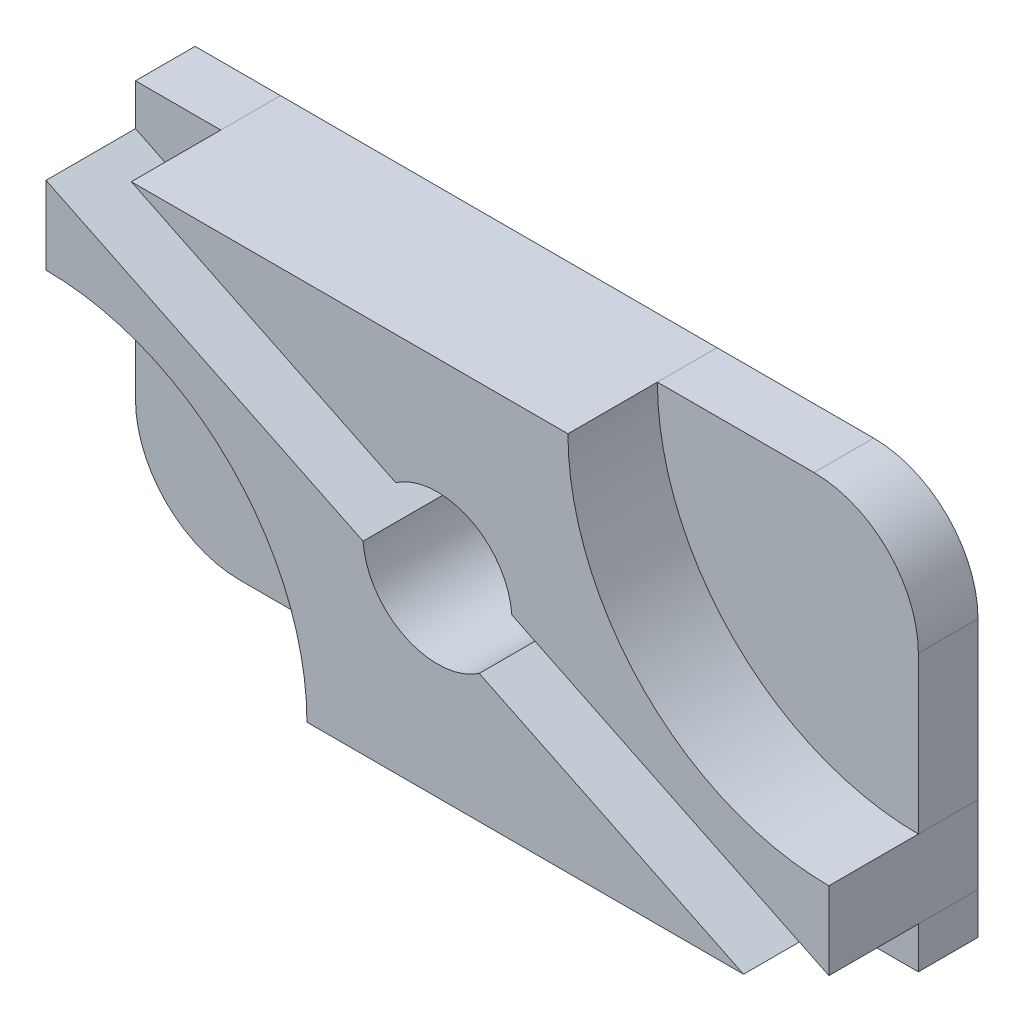
ISO-10303-21;
HEADER;
FILE_DESCRIPTION(('STEP AP214'),'2;1');
FILE_NAME('part.step','',(''),(''),'','','');
FILE_SCHEMA(('AUTOMOTIVE_DESIGN { 1 0 10303 214 1 1 1 1 }'));
ENDSEC;
DATA;
#1=APPLICATION_CONTEXT('core data for automotive mechanical design processes');
#2=APPLICATION_PROTOCOL_DEFINITION('international standard','automotive_design',2000,#1);
#3=PRODUCT_CONTEXT('',#1,'mechanical');
#4=PRODUCT('Part','Part','',(#3));
#5=PRODUCT_RELATED_PRODUCT_CATEGORY('part','',(#4));
#6=PRODUCT_DEFINITION_FORMATION('','',#4);
#7=PRODUCT_DEFINITION_CONTEXT('part definition',#1,'design');
#8=PRODUCT_DEFINITION('design','',#6,#7);
#9=PRODUCT_DEFINITION_SHAPE('','',#8);
#10=(LENGTH_UNIT() NAMED_UNIT(*) SI_UNIT(.MILLI.,.METRE.));
#11=(NAMED_UNIT(*) PLANE_ANGLE_UNIT() SI_UNIT($,.RADIAN.));
#12=(NAMED_UNIT(*) SI_UNIT($,.STERADIAN.) SOLID_ANGLE_UNIT());
#13=UNCERTAINTY_MEASURE_WITH_UNIT(LENGTH_MEASURE(1.E-05),#10,'distance_accuracy_value','');
#14=(GEOMETRIC_REPRESENTATION_CONTEXT(3) GLOBAL_UNCERTAINTY_ASSIGNED_CONTEXT((#13)) GLOBAL_UNIT_ASSIGNED_CONTEXT((#10,
#11,#12)) REPRESENTATION_CONTEXT('',''));
#15=CARTESIAN_POINT('',(0.,0.,0.));
#16=DIRECTION('',(0.,0.,1.));
#17=DIRECTION('',(1.,0.,0.));
#18=AXIS2_PLACEMENT_3D('',#15,#16,#17);
#19=CARTESIAN_POINT('',(38.5,11.5,8.));
#20=DIRECTION('',(0.,0.,-1.));
#21=DIRECTION('',(-1.,0.,0.));
#22=AXIS2_PLACEMENT_3D('',#19,#20,#21);
#23=CYLINDRICAL_SURFACE('',#22,14.);
#24=CARTESIAN_POINT('',(38.5,11.5,0.));
#25=DIRECTION('',(0.,0.,1.));
#26=DIRECTION('',(1.,0.,0.));
#27=AXIS2_PLACEMENT_3D('',#24,#25,#26);
#28=CIRCLE('',#27,14.);
#29=CARTESIAN_POINT('',(38.4999999999999,25.5,0.));
#30=VERTEX_POINT('',#29);
#31=CARTESIAN_POINT('',(52.5,11.4999999999999,0.));
#32=VERTEX_POINT('',#31);
#33=EDGE_CURVE('E201',#30,#32,#28,.F.);
#34=ORIENTED_EDGE('',*,*,#33,.F.);
#35=DIRECTION('',(0.,0.,-1.));
#36=VECTOR('',#35,1.);
#37=CARTESIAN_POINT('',(38.4999999999999,25.5,8.));
#38=LINE('',#37,#36);
#39=CARTESIAN_POINT('',(38.4999999999999,25.5,8.));
#40=VERTEX_POINT('',#39);
#41=EDGE_CURVE('E13',#40,#30,#38,.T.);
#42=ORIENTED_EDGE('',*,*,#41,.F.);
#43=CARTESIAN_POINT('',(38.5,11.5,8.));
#44=DIRECTION('',(0.,0.,1.));
#45=DIRECTION('',(1.,0.,0.));
#46=AXIS2_PLACEMENT_3D('',#43,#44,#45);
#47=CIRCLE('',#46,14.);
#48=CARTESIAN_POINT('',(52.5,11.4999999999999,8.));
#49=VERTEX_POINT('',#48);
#50=EDGE_CURVE('E197',#40,#49,#47,.F.);
#51=ORIENTED_EDGE('',*,*,#50,.T.);
#52=DIRECTION('',(0.,0.,-1.));
#53=VECTOR('',#52,1.);
#54=CARTESIAN_POINT('',(52.5,11.4999999999999,8.));
#55=LINE('',#54,#53);
#56=EDGE_CURVE('E176',#49,#32,#55,.T.);
#57=ORIENTED_EDGE('',*,*,#56,.T.);
#58=EDGE_LOOP('',(#34,#42,#51,#57));
#59=FACE_BOUND('',#58,.T.);
#60=ADVANCED_FACE('F139',(#59),#23,.T.);
#61=CARTESIAN_POINT('',(0.,25.5,8.));
#62=DIRECTION('',(0.,1.,0.));
#63=DIRECTION('',(0.,0.,1.));
#64=AXIS2_PLACEMENT_3D('',#61,#62,#63);
#65=PLANE('',#64);
#66=DIRECTION('',(1.,0.,0.));
#67=VECTOR('',#66,1.);
#68=CARTESIAN_POINT('',(0.,25.5,0.));
#69=LINE('',#68,#67);
#70=CARTESIAN_POINT('',(17.5,25.5,0.));
#71=VERTEX_POINT('',#70);
#72=EDGE_CURVE('E193',#71,#30,#69,.T.);
#73=ORIENTED_EDGE('',*,*,#72,.F.);
#74=DIRECTION('',(0.,0.,-1.));
#75=VECTOR('',#74,1.);
#76=CARTESIAN_POINT('',(17.5,25.5,8.));
#77=LINE('',#76,#75);
#78=CARTESIAN_POINT('',(17.5,25.5,8.));
#79=VERTEX_POINT('',#78);
#80=EDGE_CURVE('E146',#79,#71,#77,.T.);
#81=ORIENTED_EDGE('',*,*,#80,.F.);
#82=DIRECTION('',(1.,0.,0.));
#83=VECTOR('',#82,1.);
#84=CARTESIAN_POINT('',(0.,25.5,8.));
#85=LINE('',#84,#83);
#86=EDGE_CURVE('E186',#79,#40,#85,.T.);
#87=ORIENTED_EDGE('',*,*,#86,.T.);
#88=ORIENTED_EDGE('',*,*,#41,.T.);
#89=EDGE_LOOP('',(#73,#81,#87,#88));
#90=FACE_BOUND('',#89,.T.);
#91=ADVANCED_FACE('F190',(#90),#65,.T.);
#92=CARTESIAN_POINT('',(52.5,25.5,8.));
#93=DIRECTION('',(0.,0.,-1.));
#94=DIRECTION('',(-1.,0.,0.));
#95=AXIS2_PLACEMENT_3D('',#92,#93,#94);
#96=CYLINDRICAL_SURFACE('',#95,35.);
#97=CARTESIAN_POINT('',(52.5,25.5,0.));
#98=DIRECTION('',(0.,0.,1.));
#99=DIRECTION('',(1.,0.,0.));
#100=AXIS2_PLACEMENT_3D('',#97,#98,#99);
#101=CIRCLE('',#100,35.);
#102=CARTESIAN_POINT('',(52.5,-9.50000000000001,0.));
#103=VERTEX_POINT('',#102);
#104=EDGE_CURVE('E172',#71,#103,#101,.T.);
#105=ORIENTED_EDGE('',*,*,#104,.T.);
#106=DIRECTION('',(0.,0.,-1.));
#107=VECTOR('',#106,1.);
#108=CARTESIAN_POINT('',(52.5,-9.50000000000001,8.));
#109=LINE('',#108,#107);
#110=CARTESIAN_POINT('',(52.5,-9.50000000000001,8.));
#111=VERTEX_POINT('',#110);
#112=EDGE_CURVE('E195',#111,#103,#109,.T.);
#113=ORIENTED_EDGE('',*,*,#112,.F.);
#114=CARTESIAN_POINT('',(52.5,25.5,8.));
#115=DIRECTION('',(0.,0.,1.));
#116=DIRECTION('',(1.,0.,0.));
#117=AXIS2_PLACEMENT_3D('',#114,#115,#116);
#118=CIRCLE('',#117,35.);
#119=EDGE_CURVE('E191',#79,#111,#118,.T.);
#120=ORIENTED_EDGE('',*,*,#119,.F.);
#121=ORIENTED_EDGE('',*,*,#80,.T.);
#122=EDGE_LOOP('',(#105,#113,#120,#121));
#123=FACE_BOUND('',#122,.T.);
#124=ADVANCED_FACE('F192',(#123),#96,.T.);
#125=CARTESIAN_POINT('',(52.5,0.,8.));
#126=DIRECTION('',(-1.,0.,0.));
#127=DIRECTION('',(0.,0.,1.));
#128=AXIS2_PLACEMENT_3D('',#125,#126,#127);
#129=PLANE('',#128);
#130=DIRECTION('',(0.,1.,0.));
#131=VECTOR('',#130,1.);
#132=CARTESIAN_POINT('',(52.5,0.,0.));
#133=LINE('',#132,#131);
#134=EDGE_CURVE('E200',#103,#32,#133,.T.);
#135=ORIENTED_EDGE('',*,*,#134,.T.);
#136=ORIENTED_EDGE('',*,*,#56,.F.);
#137=DIRECTION('',(0.,1.,0.));
#138=VECTOR('',#137,1.);
#139=CARTESIAN_POINT('',(52.5,0.,8.));
#140=LINE('',#139,#138);
#141=EDGE_CURVE('E156',#111,#49,#140,.T.);
#142=ORIENTED_EDGE('',*,*,#141,.F.);
#143=ORIENTED_EDGE('',*,*,#112,.T.);
#144=EDGE_LOOP('',(#135,#136,#142,#143));
#145=FACE_BOUND('',#144,.T.);
#146=ADVANCED_FACE('F215',(#145),#129,.F.);
#147=CARTESIAN_POINT('',(0.,0.,8.));
#148=DIRECTION('',(0.,0.,1.));
#149=DIRECTION('',(1.,0.,0.));
#150=AXIS2_PLACEMENT_3D('',#147,#148,#149);
#151=PLANE('',#150);
#152=ORIENTED_EDGE('',*,*,#50,.F.);
#153=ORIENTED_EDGE('',*,*,#86,.F.);
#154=ORIENTED_EDGE('',*,*,#119,.T.);
#155=ORIENTED_EDGE('',*,*,#141,.T.);
#156=EDGE_LOOP('',(#152,#153,#154,#155));
#157=FACE_BOUND('',#156,.T.);
#158=ADVANCED_FACE('F198',(#157),#151,.T.);
#159=CARTESIAN_POINT('',(0.,0.,0.));
#160=DIRECTION('',(0.,0.,1.));
#161=DIRECTION('',(1.,0.,0.));
#162=AXIS2_PLACEMENT_3D('',#159,#160,#161);
#163=PLANE('',#162);
#164=ORIENTED_EDGE('',*,*,#33,.T.);
#165=ORIENTED_EDGE('',*,*,#134,.F.);
#166=ORIENTED_EDGE('',*,*,#104,.F.);
#167=ORIENTED_EDGE('',*,*,#72,.T.);
#168=EDGE_LOOP('',(#164,#165,#166,#167));
#169=FACE_BOUND('',#168,.T.);
#170=ADVANCED_FACE('F212',(#169),#163,.F.);
#171=CLOSED_SHELL('',(#60,#91,#124,#146,#158,#170));
#172=MANIFOLD_SOLID_BREP('B2',#171);
#173=CARTESIAN_POINT('',(52.5,25.5,20.));
#174=DIRECTION('',(0.,0.,-1.));
#175=DIRECTION('',(-1.,0.,0.));
#176=AXIS2_PLACEMENT_3D('',#173,#174,#175);
#177=CYLINDRICAL_SURFACE('',#176,35.);
#178=CARTESIAN_POINT('',(52.5,25.5,0.));
#179=DIRECTION('',(0.,0.,1.));
#180=DIRECTION('',(1.,0.,0.));
#181=AXIS2_PLACEMENT_3D('',#178,#179,#180);
#182=CIRCLE('',#181,35.);
#183=CARTESIAN_POINT('',(17.5,25.5,0.));
#184=VERTEX_POINT('',#183);
#185=CARTESIAN_POINT('',(52.5,-9.50000000000001,0.));
#186=VERTEX_POINT('',#185);
#187=EDGE_CURVE('E353',#184,#186,#182,.T.);
#188=ORIENTED_EDGE('',*,*,#187,.F.);
#189=DIRECTION('',(0.,0.,-1.));
#190=VECTOR('',#189,1.);
#191=CARTESIAN_POINT('',(17.5,25.5,20.));
#192=LINE('',#191,#190);
#193=CARTESIAN_POINT('',(17.5,25.5,20.));
#194=VERTEX_POINT('',#193);
#195=EDGE_CURVE('E136',#194,#184,#192,.T.);
#196=ORIENTED_EDGE('',*,*,#195,.F.);
#197=CARTESIAN_POINT('',(52.5,25.5,20.));
#198=DIRECTION('',(0.,0.,1.));
#199=DIRECTION('',(1.,0.,0.));
#200=AXIS2_PLACEMENT_3D('',#197,#198,#199);
#201=CIRCLE('',#200,35.);
#202=CARTESIAN_POINT('',(52.5,-9.50000000000001,20.));
#203=VERTEX_POINT('',#202);
#204=EDGE_CURVE('E366',#194,#203,#201,.T.);
#205=ORIENTED_EDGE('',*,*,#204,.T.);
#206=DIRECTION('',(0.,0.,-1.));
#207=VECTOR('',#206,1.);
#208=CARTESIAN_POINT('',(52.5,-9.50000000000001,20.));
#209=LINE('',#208,#207);
#210=EDGE_CURVE('E320',#203,#186,#209,.T.);
#211=ORIENTED_EDGE('',*,*,#210,.T.);
#212=EDGE_LOOP('',(#188,#196,#205,#211));
#213=FACE_BOUND('',#212,.T.);
#214=ADVANCED_FACE('F272',(#213),#177,.F.);
#215=CARTESIAN_POINT('',(0.,25.5,20.));
#216=DIRECTION('',(0.,1.,0.));
#217=DIRECTION('',(0.,0.,1.));
#218=AXIS2_PLACEMENT_3D('',#215,#216,#217);
#219=PLANE('',#218);
#220=DIRECTION('',(1.,0.,0.));
#221=VECTOR('',#220,1.);
#222=CARTESIAN_POINT('',(0.,25.5,0.));
#223=LINE('',#222,#221);
#224=CARTESIAN_POINT('',(-41.0558373774448,25.5,0.));
#225=VERTEX_POINT('',#224);
#226=EDGE_CURVE('E356',#225,#184,#223,.T.);
#227=ORIENTED_EDGE('',*,*,#226,.F.);
#228=DIRECTION('',(0.,0.,-1.));
#229=VECTOR('',#228,1.);
#230=CARTESIAN_POINT('',(-41.0558373774448,25.5,20.));
#231=LINE('',#230,#229);
#232=CARTESIAN_POINT('',(-41.0558373774448,25.5,20.));
#233=VERTEX_POINT('',#232);
#234=EDGE_CURVE('E282',#233,#225,#231,.T.);
#235=ORIENTED_EDGE('',*,*,#234,.F.);
#236=DIRECTION('',(1.,0.,0.));
#237=VECTOR('',#236,1.);
#238=CARTESIAN_POINT('',(0.,25.5,20.));
#239=LINE('',#238,#237);
#240=EDGE_CURVE('E348',#233,#194,#239,.T.);
#241=ORIENTED_EDGE('',*,*,#240,.T.);
#242=ORIENTED_EDGE('',*,*,#195,.T.);
#243=EDGE_LOOP('',(#227,#235,#241,#242));
#244=FACE_BOUND('',#243,.T.);
#245=ADVANCED_FACE('F377',(#244),#219,.T.);
#246=CARTESIAN_POINT('',(2.18451981368458,4.49754079288001,20.));
#247=DIRECTION('',(0.436903962736913,0.899508158575998,0.));
#248=DIRECTION('',(-0.899508158575998,0.436903962736913,0.));
#249=AXIS2_PLACEMENT_3D('',#246,#247,#248);
#250=PLANE('',#249);
#251=DIRECTION('',(0.899508158575998,-0.436903962736913,0.));
#252=VECTOR('',#251,1.);
#253=CARTESIAN_POINT('',(2.18451981368458,4.49754079288001,0.));
#254=LINE('',#253,#252);
#255=CARTESIAN_POINT('',(-5.60544934869717,8.28124010032257,0.));
#256=VERTEX_POINT('',#255);
#257=EDGE_CURVE('E363',#225,#256,#254,.T.);
#258=ORIENTED_EDGE('',*,*,#257,.T.);
#259=DIRECTION('',(0.,0.,-1.));
#260=VECTOR('',#259,1.);
#261=CARTESIAN_POINT('',(-5.60544934869717,8.28124010032257,20.));
#262=LINE('',#261,#260);
#263=CARTESIAN_POINT('',(-5.60544934869717,8.28124010032257,20.));
#264=VERTEX_POINT('',#263);
#265=EDGE_CURVE('E339',#264,#256,#262,.T.);
#266=ORIENTED_EDGE('',*,*,#265,.F.);
#267=DIRECTION('',(0.899508158575998,-0.436903962736913,0.));
#268=VECTOR('',#267,1.);
#269=CARTESIAN_POINT('',(2.18451981368458,4.49754079288001,20.));
#270=LINE('',#269,#268);
#271=EDGE_CURVE('E350',#233,#264,#270,.T.);
#272=ORIENTED_EDGE('',*,*,#271,.F.);
#273=ORIENTED_EDGE('',*,*,#234,.T.);
#274=EDGE_LOOP('',(#258,#266,#272,#273));
#275=FACE_BOUND('',#274,.T.);
#276=ADVANCED_FACE('F373',(#275),#250,.F.);
#277=CARTESIAN_POINT('',(0.,0.,20.));
#278=DIRECTION('',(0.,0.,-1.));
#279=DIRECTION('',(-1.,0.,0.));
#280=AXIS2_PLACEMENT_3D('',#277,#278,#279);
#281=CYLINDRICAL_SURFACE('',#280,10.);
#282=CARTESIAN_POINT('',(0.,0.,0.));
#283=DIRECTION('',(0.,0.,1.));
#284=DIRECTION('',(1.,0.,0.));
#285=AXIS2_PLACEMENT_3D('',#282,#283,#284);
#286=CIRCLE('',#285,10.);
#287=CARTESIAN_POINT('',(9.97448897606632,0.713841485437452,0.));
#288=VERTEX_POINT('',#287);
#289=EDGE_CURVE('E340',#288,#256,#286,.T.);
#290=ORIENTED_EDGE('',*,*,#289,.F.);
#291=DIRECTION('',(0.,0.,-1.));
#292=VECTOR('',#291,1.);
#293=CARTESIAN_POINT('',(9.97448897606632,0.713841485437452,20.));
#294=LINE('',#293,#292);
#295=CARTESIAN_POINT('',(9.97448897606632,0.713841485437452,20.));
#296=VERTEX_POINT('',#295);
#297=EDGE_CURVE('E332',#296,#288,#294,.T.);
#298=ORIENTED_EDGE('',*,*,#297,.F.);
#299=CARTESIAN_POINT('',(0.,0.,20.));
#300=DIRECTION('',(0.,0.,1.));
#301=DIRECTION('',(1.,0.,0.));
#302=AXIS2_PLACEMENT_3D('',#299,#300,#301);
#303=CIRCLE('',#302,10.);
#304=EDGE_CURVE('E333',#296,#264,#303,.T.);
#305=ORIENTED_EDGE('',*,*,#304,.T.);
#306=ORIENTED_EDGE('',*,*,#265,.T.);
#307=EDGE_LOOP('',(#290,#298,#305,#306));
#308=FACE_BOUND('',#307,.T.);
#309=ADVANCED_FACE('F334',(#308),#281,.F.);
#310=CARTESIAN_POINT('',(2.18451981368458,4.49754079288001,20.));
#311=DIRECTION('',(0.436903962736913,0.899508158575998,0.));
#312=DIRECTION('',(-0.899508158575998,0.436903962736913,0.));
#313=AXIS2_PLACEMENT_3D('',#310,#311,#312);
#314=PLANE('',#313);
#315=DIRECTION('',(0.899508158575998,-0.436903962736913,0.));
#316=VECTOR('',#315,1.);
#317=CARTESIAN_POINT('',(2.18451981368458,4.49754079288001,0.));
#318=LINE('',#317,#316);
#319=CARTESIAN_POINT('',(52.5,-19.9414067261875,0.));
#320=VERTEX_POINT('',#319);
#321=EDGE_CURVE('E309',#288,#320,#318,.T.);
#322=ORIENTED_EDGE('',*,*,#321,.T.);
#323=DIRECTION('',(0.,0.,-1.));
#324=VECTOR('',#323,1.);
#325=CARTESIAN_POINT('',(52.5,-19.9414067261875,20.));
#326=LINE('',#325,#324);
#327=CARTESIAN_POINT('',(52.5,-19.9414067261875,20.));
#328=VERTEX_POINT('',#327);
#329=EDGE_CURVE('E336',#328,#320,#326,.T.);
#330=ORIENTED_EDGE('',*,*,#329,.F.);
#331=DIRECTION('',(0.899508158575998,-0.436903962736913,0.));
#332=VECTOR('',#331,1.);
#333=CARTESIAN_POINT('',(2.18451981368458,4.49754079288001,20.));
#334=LINE('',#333,#332);
#335=EDGE_CURVE('E343',#296,#328,#334,.T.);
#336=ORIENTED_EDGE('',*,*,#335,.F.);
#337=ORIENTED_EDGE('',*,*,#297,.T.);
#338=EDGE_LOOP('',(#322,#330,#336,#337));
#339=FACE_BOUND('',#338,.T.);
#340=ADVANCED_FACE('F345',(#339),#314,.F.);
#341=CARTESIAN_POINT('',(52.5,0.,20.));
#342=DIRECTION('',(-1.,0.,0.));
#343=DIRECTION('',(0.,0.,1.));
#344=AXIS2_PLACEMENT_3D('',#341,#342,#343);
#345=PLANE('',#344);
#346=DIRECTION('',(0.,1.,0.));
#347=VECTOR('',#346,1.);
#348=CARTESIAN_POINT('',(52.5,0.,0.));
#349=LINE('',#348,#347);
#350=EDGE_CURVE('E368',#320,#186,#349,.T.);
#351=ORIENTED_EDGE('',*,*,#350,.T.);
#352=ORIENTED_EDGE('',*,*,#210,.F.);
#353=DIRECTION('',(0.,1.,0.));
#354=VECTOR('',#353,1.);
#355=CARTESIAN_POINT('',(52.5,0.,20.));
#356=LINE('',#355,#354);
#357=EDGE_CURVE('E287',#328,#203,#356,.T.);
#358=ORIENTED_EDGE('',*,*,#357,.F.);
#359=ORIENTED_EDGE('',*,*,#329,.T.);
#360=EDGE_LOOP('',(#351,#352,#358,#359));
#361=FACE_BOUND('',#360,.T.);
#362=ADVANCED_FACE('F385',(#361),#345,.F.);
#363=CARTESIAN_POINT('',(0.,0.,20.));
#364=DIRECTION('',(0.,0.,1.));
#365=DIRECTION('',(1.,0.,0.));
#366=AXIS2_PLACEMENT_3D('',#363,#364,#365);
#367=PLANE('',#366);
#368=ORIENTED_EDGE('',*,*,#204,.F.);
#369=ORIENTED_EDGE('',*,*,#240,.F.);
#370=ORIENTED_EDGE('',*,*,#271,.T.);
#371=ORIENTED_EDGE('',*,*,#304,.F.);
#372=ORIENTED_EDGE('',*,*,#335,.T.);
#373=ORIENTED_EDGE('',*,*,#357,.T.);
#374=EDGE_LOOP('',(#368,#369,#370,#371,#372,#373));
#375=FACE_BOUND('',#374,.T.);
#376=ADVANCED_FACE('F342',(#375),#367,.T.);
#377=CARTESIAN_POINT('',(0.,0.,0.));
#378=DIRECTION('',(0.,0.,1.));
#379=DIRECTION('',(1.,0.,0.));
#380=AXIS2_PLACEMENT_3D('',#377,#378,#379);
#381=PLANE('',#380);
#382=ORIENTED_EDGE('',*,*,#187,.T.);
#383=ORIENTED_EDGE('',*,*,#350,.F.);
#384=ORIENTED_EDGE('',*,*,#321,.F.);
#385=ORIENTED_EDGE('',*,*,#289,.T.);
#386=ORIENTED_EDGE('',*,*,#257,.F.);
#387=ORIENTED_EDGE('',*,*,#226,.T.);
#388=EDGE_LOOP('',(#382,#383,#384,#385,#386,#387));
#389=FACE_BOUND('',#388,.T.);
#390=ADVANCED_FACE('F378',(#389),#381,.F.);
#391=CLOSED_SHELL('',(#214,#245,#276,#309,#340,#362,#376,#390));
#392=MANIFOLD_SOLID_BREP('B7',#391);
#393=CARTESIAN_POINT('',(-52.5,-25.5,20.));
#394=DIRECTION('',(0.,0.,-1.));
#395=DIRECTION('',(-1.,0.,0.));
#396=AXIS2_PLACEMENT_3D('',#393,#394,#395);
#397=CYLINDRICAL_SURFACE('',#396,35.);
#398=CARTESIAN_POINT('',(-52.5,-25.5,8.));
#399=DIRECTION('',(0.,0.,1.));
#400=DIRECTION('',(1.,0.,0.));
#401=AXIS2_PLACEMENT_3D('',#398,#399,#400);
#402=CIRCLE('',#401,35.);
#403=CARTESIAN_POINT('',(-17.5,-25.5,8.));
#404=VERTEX_POINT('',#403);
#405=CARTESIAN_POINT('',(-52.5,9.50000000000001,8.));
#406=VERTEX_POINT('',#405);
#407=EDGE_CURVE('E618',#404,#406,#402,.T.);
#408=ORIENTED_EDGE('',*,*,#407,.F.);
#409=DIRECTION('',(0.,0.,-1.));
#410=VECTOR('',#409,1.);
#411=CARTESIAN_POINT('',(-17.5,-25.5,20.));
#412=LINE('',#411,#410);
#413=CARTESIAN_POINT('',(-17.5,-25.5,20.));
#414=VERTEX_POINT('',#413);
#415=EDGE_CURVE('E271',#414,#404,#412,.T.);
#416=ORIENTED_EDGE('',*,*,#415,.F.);
#417=CARTESIAN_POINT('',(-52.5,-25.5,20.));
#418=DIRECTION('',(0.,0.,1.));
#419=DIRECTION('',(1.,0.,0.));
#420=AXIS2_PLACEMENT_3D('',#417,#418,#419);
#421=CIRCLE('',#420,35.);
#422=CARTESIAN_POINT('',(-52.5,9.50000000000001,20.));
#423=VERTEX_POINT('',#422);
#424=EDGE_CURVE('E584',#414,#423,#421,.T.);
#425=ORIENTED_EDGE('',*,*,#424,.T.);
#426=DIRECTION('',(0.,0.,-1.));
#427=VECTOR('',#426,1.);
#428=CARTESIAN_POINT('',(-52.5,9.50000000000001,20.));
#429=LINE('',#428,#427);
#430=EDGE_CURVE('E579',#423,#406,#429,.T.);
#431=ORIENTED_EDGE('',*,*,#430,.T.);
#432=EDGE_LOOP('',(#408,#416,#425,#431));
#433=FACE_BOUND('',#432,.T.);
#434=ADVANCED_FACE('F446',(#433),#397,.F.);
#435=CARTESIAN_POINT('',(0.,-25.5,20.));
#436=DIRECTION('',(0.,1.,0.));
#437=DIRECTION('',(0.,0.,1.));
#438=AXIS2_PLACEMENT_3D('',#435,#436,#437);
#439=PLANE('',#438);
#440=DIRECTION('',(1.,0.,0.));
#441=VECTOR('',#440,1.);
#442=CARTESIAN_POINT('',(0.,-25.5,0.));
#443=LINE('',#442,#441);
#444=CARTESIAN_POINT('',(-38.4999999999999,-25.5,0.));
#445=VERTEX_POINT('',#444);
#446=CARTESIAN_POINT('',(52.5,-25.5,0.));
#447=VERTEX_POINT('',#446);
#448=EDGE_CURVE('E586',#445,#447,#443,.T.);
#449=ORIENTED_EDGE('',*,*,#448,.T.);
#450=DIRECTION('',(0.,0.,-1.));
#451=VECTOR('',#450,1.);
#452=CARTESIAN_POINT('',(52.5,-25.5,8.));
#453=LINE('',#452,#451);
#454=CARTESIAN_POINT('',(52.5,-25.5,8.));
#455=VERTEX_POINT('',#454);
#456=EDGE_CURVE('E556',#455,#447,#453,.T.);
#457=ORIENTED_EDGE('',*,*,#456,.F.);
#458=DIRECTION('',(1.,0.,0.));
#459=VECTOR('',#458,1.);
#460=CARTESIAN_POINT('',(0.,-25.5,8.));
#461=LINE('',#460,#459);
#462=CARTESIAN_POINT('',(41.0558373774448,-25.5,8.));
#463=VERTEX_POINT('',#462);
#464=EDGE_CURVE('E554',#463,#455,#461,.T.);
#465=ORIENTED_EDGE('',*,*,#464,.F.);
#466=DIRECTION('',(0.,0.,-1.));
#467=VECTOR('',#466,1.);
#468=CARTESIAN_POINT('',(41.0558373774448,-25.5,20.));
#469=LINE('',#468,#467);
#470=CARTESIAN_POINT('',(41.0558373774448,-25.5,20.));
#471=VERTEX_POINT('',#470);
#472=EDGE_CURVE('E457',#471,#463,#469,.T.);
#473=ORIENTED_EDGE('',*,*,#472,.F.);
#474=DIRECTION('',(1.,0.,0.));
#475=VECTOR('',#474,1.);
#476=CARTESIAN_POINT('',(0.,-25.5,20.));
#477=LINE('',#476,#475);
#478=EDGE_CURVE('E597',#414,#471,#477,.T.);
#479=ORIENTED_EDGE('',*,*,#478,.F.);
#480=ORIENTED_EDGE('',*,*,#415,.T.);
#481=DIRECTION('',(1.,0.,0.));
#482=VECTOR('',#481,1.);
#483=CARTESIAN_POINT('',(0.,-25.5,8.));
#484=LINE('',#483,#482);
#485=CARTESIAN_POINT('',(-38.4999999999999,-25.5,8.));
#486=VERTEX_POINT('',#485);
#487=EDGE_CURVE('E617',#486,#404,#484,.T.);
#488=ORIENTED_EDGE('',*,*,#487,.F.);
#489=DIRECTION('',(0.,0.,-1.));
#490=VECTOR('',#489,1.);
#491=CARTESIAN_POINT('',(-38.4999999999999,-25.5,8.));
#492=LINE('',#491,#490);
#493=EDGE_CURVE('E587',#486,#445,#492,.T.);
#494=ORIENTED_EDGE('',*,*,#493,.T.);
#495=EDGE_LOOP('',(#449,#457,#465,#473,#479,#480,#488,#494));
#496=FACE_BOUND('',#495,.T.);
#497=ADVANCED_FACE('F551',(#496),#439,.F.);
#498=CARTESIAN_POINT('',(-2.18451981368457,-4.49754079287999,20.));
#499=DIRECTION('',(-0.436903962736913,-0.899508158575998,0.));
#500=DIRECTION('',(0.899508158575998,-0.436903962736913,0.));
#501=AXIS2_PLACEMENT_3D('',#498,#499,#500);
#502=PLANE('',#501);
#503=ORIENTED_EDGE('',*,*,#472,.T.);
#504=DIRECTION('',(-0.899508158575998,0.436903962736913,0.));
#505=VECTOR('',#504,1.);
#506=CARTESIAN_POINT('',(-2.18451981368457,-4.49754079287999,8.));
#507=LINE('',#506,#505);
#508=CARTESIAN_POINT('',(5.60544934869717,-8.28124010032256,8.));
#509=VERTEX_POINT('',#508);
#510=EDGE_CURVE('E565',#463,#509,#507,.T.);
#511=ORIENTED_EDGE('',*,*,#510,.T.);
#512=DIRECTION('',(0.,0.,-1.));
#513=VECTOR('',#512,1.);
#514=CARTESIAN_POINT('',(5.60544934869717,-8.28124010032256,20.));
#515=LINE('',#514,#513);
#516=CARTESIAN_POINT('',(5.60544934869717,-8.28124010032256,20.));
#517=VERTEX_POINT('',#516);
#518=EDGE_CURVE('E572',#517,#509,#515,.T.);
#519=ORIENTED_EDGE('',*,*,#518,.F.);
#520=DIRECTION('',(-0.899508158575998,0.436903962736913,0.));
#521=VECTOR('',#520,1.);
#522=CARTESIAN_POINT('',(-2.18451981368457,-4.49754079287999,20.));
#523=LINE('',#522,#521);
#524=EDGE_CURVE('E568',#471,#517,#523,.T.);
#525=ORIENTED_EDGE('',*,*,#524,.F.);
#526=EDGE_LOOP('',(#503,#511,#519,#525));
#527=FACE_BOUND('',#526,.T.);
#528=ADVANCED_FACE('F569',(#527),#502,.F.);
#529=CARTESIAN_POINT('',(0.,0.,20.));
#530=DIRECTION('',(0.,0.,-1.));
#531=DIRECTION('',(-1.,0.,0.));
#532=AXIS2_PLACEMENT_3D('',#529,#530,#531);
#533=CYLINDRICAL_SURFACE('',#532,10.);
#534=CARTESIAN_POINT('',(0.,0.,0.));
#535=DIRECTION('',(0.,0.,1.));
#536=DIRECTION('',(1.,0.,0.));
#537=AXIS2_PLACEMENT_3D('',#534,#535,#536);
#538=CIRCLE('',#537,10.);
#539=CARTESIAN_POINT('',(-5.60544934869717,8.28124010032257,0.));
#540=VERTEX_POINT('',#539);
#541=CARTESIAN_POINT('',(9.97448897606632,0.713841485437452,0.));
#542=VERTEX_POINT('',#541);
#543=EDGE_CURVE('E588',#540,#542,#538,.T.);
#544=ORIENTED_EDGE('',*,*,#543,.F.);
#545=DIRECTION('',(0.,0.,-1.));
#546=VECTOR('',#545,1.);
#547=CARTESIAN_POINT('',(-5.60544934869717,8.28124010032257,8.));
#548=LINE('',#547,#546);
#549=CARTESIAN_POINT('',(-5.60544934869717,8.28124010032257,8.));
#550=VERTEX_POINT('',#549);
#551=EDGE_CURVE('E614',#550,#540,#548,.T.);
#552=ORIENTED_EDGE('',*,*,#551,.F.);
#553=CARTESIAN_POINT('',(0.,0.,8.));
#554=DIRECTION('',(0.,0.,1.));
#555=DIRECTION('',(1.,0.,0.));
#556=AXIS2_PLACEMENT_3D('',#553,#554,#555);
#557=CIRCLE('',#556,10.);
#558=CARTESIAN_POINT('',(-9.97448897606632,-0.713841485437421,8.));
#559=VERTEX_POINT('',#558);
#560=EDGE_CURVE('E634',#550,#559,#557,.T.);
#561=ORIENTED_EDGE('',*,*,#560,.T.);
#562=DIRECTION('',(0.,0.,-1.));
#563=VECTOR('',#562,1.);
#564=CARTESIAN_POINT('',(-9.97448897606632,-0.713841485437421,20.));
#565=LINE('',#564,#563);
#566=CARTESIAN_POINT('',(-9.97448897606632,-0.713841485437421,20.));
#567=VERTEX_POINT('',#566);
#568=EDGE_CURVE('E575',#567,#559,#565,.T.);
#569=ORIENTED_EDGE('',*,*,#568,.F.);
#570=CARTESIAN_POINT('',(0.,0.,20.));
#571=DIRECTION('',(0.,0.,1.));
#572=DIRECTION('',(1.,0.,0.));
#573=AXIS2_PLACEMENT_3D('',#570,#571,#572);
#574=CIRCLE('',#573,10.);
#575=EDGE_CURVE('E594',#567,#517,#574,.T.);
#576=ORIENTED_EDGE('',*,*,#575,.T.);
#577=ORIENTED_EDGE('',*,*,#518,.T.);
#578=CARTESIAN_POINT('',(0.,0.,8.));
#579=DIRECTION('',(0.,0.,1.));
#580=DIRECTION('',(1.,0.,0.));
#581=AXIS2_PLACEMENT_3D('',#578,#579,#580);
#582=CIRCLE('',#581,10.);
#583=CARTESIAN_POINT('',(9.97448897606632,0.713841485437452,8.));
#584=VERTEX_POINT('',#583);
#585=EDGE_CURVE('E464',#509,#584,#582,.T.);
#586=ORIENTED_EDGE('',*,*,#585,.T.);
#587=DIRECTION('',(0.,0.,-1.));
#588=VECTOR('',#587,1.);
#589=CARTESIAN_POINT('',(9.97448897606632,0.713841485437452,8.));
#590=LINE('',#589,#588);
#591=EDGE_CURVE('E651',#584,#542,#590,.T.);
#592=ORIENTED_EDGE('',*,*,#591,.T.);
#593=EDGE_LOOP('',(#544,#552,#561,#569,#576,#577,#586,#592));
#594=FACE_BOUND('',#593,.T.);
#595=ADVANCED_FACE('F663',(#594),#533,.F.);
#596=CARTESIAN_POINT('',(-2.18451981368456,-4.49754079287999,20.));
#597=DIRECTION('',(-0.436903962736913,-0.899508158575998,0.));
#598=DIRECTION('',(0.899508158575998,-0.436903962736913,0.));
#599=AXIS2_PLACEMENT_3D('',#596,#597,#598);
#600=PLANE('',#599);
#601=ORIENTED_EDGE('',*,*,#568,.T.);
#602=DIRECTION('',(-0.899508158575998,0.436903962736913,0.));
#603=VECTOR('',#602,1.);
#604=CARTESIAN_POINT('',(-2.18451981368456,-4.49754079287999,8.));
#605=LINE('',#604,#603);
#606=CARTESIAN_POINT('',(-52.5,19.9414067261875,8.));
#607=VERTEX_POINT('',#606);
#608=EDGE_CURVE('E633',#559,#607,#605,.T.);
#609=ORIENTED_EDGE('',*,*,#608,.T.);
#610=DIRECTION('',(0.,0.,-1.));
#611=VECTOR('',#610,1.);
#612=CARTESIAN_POINT('',(-52.5,19.9414067261875,20.));
#613=LINE('',#612,#611);
#614=CARTESIAN_POINT('',(-52.5,19.9414067261875,20.));
#615=VERTEX_POINT('',#614);
#616=EDGE_CURVE('E580',#615,#607,#613,.T.);
#617=ORIENTED_EDGE('',*,*,#616,.F.);
#618=DIRECTION('',(-0.899508158575998,0.436903962736913,0.));
#619=VECTOR('',#618,1.);
#620=CARTESIAN_POINT('',(-2.18451981368456,-4.49754079287999,20.));
#621=LINE('',#620,#619);
#622=EDGE_CURVE('E593',#567,#615,#621,.T.);
#623=ORIENTED_EDGE('',*,*,#622,.F.);
#624=EDGE_LOOP('',(#601,#609,#617,#623));
#625=FACE_BOUND('',#624,.T.);
#626=ADVANCED_FACE('F686',(#625),#600,.F.);
#627=CARTESIAN_POINT('',(-52.5,0.,20.));
#628=DIRECTION('',(-1.,0.,0.));
#629=DIRECTION('',(0.,0.,1.));
#630=AXIS2_PLACEMENT_3D('',#627,#628,#629);
#631=PLANE('',#630);
#632=DIRECTION('',(0.,1.,0.));
#633=VECTOR('',#632,1.);
#634=CARTESIAN_POINT('',(-52.5,0.,0.));
#635=LINE('',#634,#633);
#636=CARTESIAN_POINT('',(-52.5,-11.4999999999999,0.));
#637=VERTEX_POINT('',#636);
#638=CARTESIAN_POINT('',(-52.5,25.5,0.));
#639=VERTEX_POINT('',#638);
#640=EDGE_CURVE('E581',#637,#639,#635,.T.);
#641=ORIENTED_EDGE('',*,*,#640,.F.);
#642=DIRECTION('',(0.,0.,-1.));
#643=VECTOR('',#642,1.);
#644=CARTESIAN_POINT('',(-52.5,-11.4999999999999,8.));
#645=LINE('',#644,#643);
#646=CARTESIAN_POINT('',(-52.5,-11.4999999999999,8.));
#647=VERTEX_POINT('',#646);
#648=EDGE_CURVE('E604',#647,#637,#645,.T.);
#649=ORIENTED_EDGE('',*,*,#648,.F.);
#650=DIRECTION('',(0.,1.,0.));
#651=VECTOR('',#650,1.);
#652=CARTESIAN_POINT('',(-52.5,0.,8.));
#653=LINE('',#652,#651);
#654=EDGE_CURVE('E609',#647,#406,#653,.T.);
#655=ORIENTED_EDGE('',*,*,#654,.T.);
#656=ORIENTED_EDGE('',*,*,#430,.F.);
#657=DIRECTION('',(0.,1.,0.));
#658=VECTOR('',#657,1.);
#659=CARTESIAN_POINT('',(-52.5,0.,20.));
#660=LINE('',#659,#658);
#661=EDGE_CURVE('E582',#423,#615,#660,.T.);
#662=ORIENTED_EDGE('',*,*,#661,.T.);
#663=ORIENTED_EDGE('',*,*,#616,.T.);
#664=DIRECTION('',(0.,1.,0.));
#665=VECTOR('',#664,1.);
#666=CARTESIAN_POINT('',(-52.5,0.,8.));
#667=LINE('',#666,#665);
#668=CARTESIAN_POINT('',(-52.5,25.5,8.));
#669=VERTEX_POINT('',#668);
#670=EDGE_CURVE('E473',#607,#669,#667,.T.);
#671=ORIENTED_EDGE('',*,*,#670,.T.);
#672=DIRECTION('',(0.,0.,-1.));
#673=VECTOR('',#672,1.);
#674=CARTESIAN_POINT('',(-52.5,25.5,8.));
#675=LINE('',#674,#673);
#676=EDGE_CURVE('E629',#669,#639,#675,.T.);
#677=ORIENTED_EDGE('',*,*,#676,.T.);
#678=EDGE_LOOP('',(#641,#649,#655,#656,#662,#663,#671,#677));
#679=FACE_BOUND('',#678,.T.);
#680=ADVANCED_FACE('F684',(#679),#631,.T.);
#681=CARTESIAN_POINT('',(0.,0.,20.));
#682=DIRECTION('',(0.,0.,1.));
#683=DIRECTION('',(1.,0.,0.));
#684=AXIS2_PLACEMENT_3D('',#681,#682,#683);
#685=PLANE('',#684);
#686=ORIENTED_EDGE('',*,*,#424,.F.);
#687=ORIENTED_EDGE('',*,*,#478,.T.);
#688=ORIENTED_EDGE('',*,*,#524,.T.);
#689=ORIENTED_EDGE('',*,*,#575,.F.);
#690=ORIENTED_EDGE('',*,*,#622,.T.);
#691=ORIENTED_EDGE('',*,*,#661,.F.);
#692=EDGE_LOOP('',(#686,#687,#688,#689,#690,#691));
#693=FACE_BOUND('',#692,.T.);
#694=ADVANCED_FACE('F692',(#693),#685,.T.);
#695=CARTESIAN_POINT('',(0.,0.,0.));
#696=DIRECTION('',(0.,0.,1.));
#697=DIRECTION('',(1.,0.,0.));
#698=AXIS2_PLACEMENT_3D('',#695,#696,#697);
#699=PLANE('',#698);
#700=ORIENTED_EDGE('',*,*,#448,.F.);
#701=CARTESIAN_POINT('',(-38.5,-11.5,0.));
#702=DIRECTION('',(0.,0.,1.));
#703=DIRECTION('',(1.,0.,0.));
#704=AXIS2_PLACEMENT_3D('',#701,#702,#703);
#705=CIRCLE('',#704,14.);
#706=EDGE_CURVE('E606',#445,#637,#705,.F.);
#707=ORIENTED_EDGE('',*,*,#706,.T.);
#708=ORIENTED_EDGE('',*,*,#640,.T.);
#709=DIRECTION('',(1.,0.,0.));
#710=VECTOR('',#709,1.);
#711=CARTESIAN_POINT('',(0.,25.5,0.));
#712=LINE('',#711,#710);
#713=CARTESIAN_POINT('',(-41.0558373774448,25.5,0.));
#714=VERTEX_POINT('',#713);
#715=EDGE_CURVE('E635',#639,#714,#712,.T.);
#716=ORIENTED_EDGE('',*,*,#715,.T.);
#717=DIRECTION('',(0.899508158575998,-0.436903962736913,0.));
#718=VECTOR('',#717,1.);
#719=CARTESIAN_POINT('',(2.18451981368458,4.49754079288001,0.));
#720=LINE('',#719,#718);
#721=EDGE_CURVE('E638',#714,#540,#720,.T.);
#722=ORIENTED_EDGE('',*,*,#721,.T.);
#723=ORIENTED_EDGE('',*,*,#543,.T.);
#724=DIRECTION('',(0.899508158575998,-0.436903962736913,0.));
#725=VECTOR('',#724,1.);
#726=CARTESIAN_POINT('',(2.18451981368458,4.49754079288001,0.));
#727=LINE('',#726,#725);
#728=CARTESIAN_POINT('',(52.5,-19.9414067261875,0.));
#729=VERTEX_POINT('',#728);
#730=EDGE_CURVE('E654',#542,#729,#727,.T.);
#731=ORIENTED_EDGE('',*,*,#730,.T.);
#732=DIRECTION('',(0.,1.,0.));
#733=VECTOR('',#732,1.);
#734=CARTESIAN_POINT('',(52.5,0.,0.));
#735=LINE('',#734,#733);
#736=EDGE_CURVE('E657',#447,#729,#735,.T.);
#737=ORIENTED_EDGE('',*,*,#736,.F.);
#738=EDGE_LOOP('',(#700,#707,#708,#716,#722,#723,#731,#737));
#739=FACE_BOUND('',#738,.T.);
#740=ADVANCED_FACE('F675',(#739),#699,.F.);
#741=CARTESIAN_POINT('',(-38.5,-11.5,8.));
#742=DIRECTION('',(0.,0.,-1.));
#743=DIRECTION('',(-1.,0.,0.));
#744=AXIS2_PLACEMENT_3D('',#741,#742,#743);
#745=CYLINDRICAL_SURFACE('',#744,14.);
#746=ORIENTED_EDGE('',*,*,#706,.F.);
#747=ORIENTED_EDGE('',*,*,#493,.F.);
#748=CARTESIAN_POINT('',(-38.5,-11.5,8.));
#749=DIRECTION('',(0.,0.,1.));
#750=DIRECTION('',(1.,0.,0.));
#751=AXIS2_PLACEMENT_3D('',#748,#749,#750);
#752=CIRCLE('',#751,14.);
#753=EDGE_CURVE('E615',#486,#647,#752,.F.);
#754=ORIENTED_EDGE('',*,*,#753,.T.);
#755=ORIENTED_EDGE('',*,*,#648,.T.);
#756=EDGE_LOOP('',(#746,#747,#754,#755));
#757=FACE_BOUND('',#756,.T.);
#758=ADVANCED_FACE('F701',(#757),#745,.T.);
#759=CARTESIAN_POINT('',(0.,0.,8.));
#760=DIRECTION('',(0.,0.,1.));
#761=DIRECTION('',(1.,0.,0.));
#762=AXIS2_PLACEMENT_3D('',#759,#760,#761);
#763=PLANE('',#762);
#764=ORIENTED_EDGE('',*,*,#753,.F.);
#765=ORIENTED_EDGE('',*,*,#487,.T.);
#766=ORIENTED_EDGE('',*,*,#407,.T.);
#767=ORIENTED_EDGE('',*,*,#654,.F.);
#768=EDGE_LOOP('',(#764,#765,#766,#767));
#769=FACE_BOUND('',#768,.T.);
#770=ADVANCED_FACE('F700',(#769),#763,.T.);
#771=CARTESIAN_POINT('',(2.18451981368458,4.49754079288001,8.));
#772=DIRECTION('',(0.436903962736913,0.899508158575998,0.));
#773=DIRECTION('',(-0.899508158575998,0.436903962736913,0.));
#774=AXIS2_PLACEMENT_3D('',#771,#772,#773);
#775=PLANE('',#774);
#776=ORIENTED_EDGE('',*,*,#721,.F.);
#777=DIRECTION('',(0.,0.,-1.));
#778=VECTOR('',#777,1.);
#779=CARTESIAN_POINT('',(-41.0558373774448,25.5,8.));
#780=LINE('',#779,#778);
#781=CARTESIAN_POINT('',(-41.0558373774448,25.5,8.));
#782=VERTEX_POINT('',#781);
#783=EDGE_CURVE('E627',#782,#714,#780,.T.);
#784=ORIENTED_EDGE('',*,*,#783,.F.);
#785=DIRECTION('',(0.899508158575998,-0.436903962736913,0.));
#786=VECTOR('',#785,1.);
#787=CARTESIAN_POINT('',(2.18451981368458,4.49754079288001,8.));
#788=LINE('',#787,#786);
#789=EDGE_CURVE('E644',#782,#550,#788,.T.);
#790=ORIENTED_EDGE('',*,*,#789,.T.);
#791=ORIENTED_EDGE('',*,*,#551,.T.);
#792=EDGE_LOOP('',(#776,#784,#790,#791));
#793=FACE_BOUND('',#792,.T.);
#794=ADVANCED_FACE('F677',(#793),#775,.T.);
#795=CARTESIAN_POINT('',(0.,25.5,8.));
#796=DIRECTION('',(0.,1.,0.));
#797=DIRECTION('',(0.,0.,1.));
#798=AXIS2_PLACEMENT_3D('',#795,#796,#797);
#799=PLANE('',#798);
#800=ORIENTED_EDGE('',*,*,#715,.F.);
#801=ORIENTED_EDGE('',*,*,#676,.F.);
#802=DIRECTION('',(1.,0.,0.));
#803=VECTOR('',#802,1.);
#804=CARTESIAN_POINT('',(0.,25.5,8.));
#805=LINE('',#804,#803);
#806=EDGE_CURVE('E643',#669,#782,#805,.T.);
#807=ORIENTED_EDGE('',*,*,#806,.T.);
#808=ORIENTED_EDGE('',*,*,#783,.T.);
#809=EDGE_LOOP('',(#800,#801,#807,#808));
#810=FACE_BOUND('',#809,.T.);
#811=ADVANCED_FACE('F682',(#810),#799,.T.);
#812=CARTESIAN_POINT('',(0.,0.,8.));
#813=DIRECTION('',(0.,0.,1.));
#814=DIRECTION('',(1.,0.,0.));
#815=AXIS2_PLACEMENT_3D('',#812,#813,#814);
#816=PLANE('',#815);
#817=ORIENTED_EDGE('',*,*,#560,.F.);
#818=ORIENTED_EDGE('',*,*,#789,.F.);
#819=ORIENTED_EDGE('',*,*,#806,.F.);
#820=ORIENTED_EDGE('',*,*,#670,.F.);
#821=ORIENTED_EDGE('',*,*,#608,.F.);
#822=EDGE_LOOP('',(#817,#818,#819,#820,#821));
#823=FACE_BOUND('',#822,.T.);
#824=ADVANCED_FACE('F676',(#823),#816,.T.);
#825=CARTESIAN_POINT('',(52.5,0.,8.));
#826=DIRECTION('',(-1.,0.,0.));
#827=DIRECTION('',(0.,0.,1.));
#828=AXIS2_PLACEMENT_3D('',#825,#826,#827);
#829=PLANE('',#828);
#830=ORIENTED_EDGE('',*,*,#736,.T.);
#831=DIRECTION('',(0.,0.,-1.));
#832=VECTOR('',#831,1.);
#833=CARTESIAN_POINT('',(52.5,-19.9414067261875,8.));
#834=LINE('',#833,#832);
#835=CARTESIAN_POINT('',(52.5,-19.9414067261875,8.));
#836=VERTEX_POINT('',#835);
#837=EDGE_CURVE('E647',#836,#729,#834,.T.);
#838=ORIENTED_EDGE('',*,*,#837,.F.);
#839=DIRECTION('',(0.,1.,0.));
#840=VECTOR('',#839,1.);
#841=CARTESIAN_POINT('',(52.5,0.,8.));
#842=LINE('',#841,#840);
#843=EDGE_CURVE('E563',#455,#836,#842,.T.);
#844=ORIENTED_EDGE('',*,*,#843,.F.);
#845=ORIENTED_EDGE('',*,*,#456,.T.);
#846=EDGE_LOOP('',(#830,#838,#844,#845));
#847=FACE_BOUND('',#846,.T.);
#848=ADVANCED_FACE('F703',(#847),#829,.F.);
#849=CARTESIAN_POINT('',(2.18451981368458,4.49754079288001,8.));
#850=DIRECTION('',(0.436903962736913,0.899508158575998,0.));
#851=DIRECTION('',(-0.899508158575998,0.436903962736913,0.));
#852=AXIS2_PLACEMENT_3D('',#849,#850,#851);
#853=PLANE('',#852);
#854=ORIENTED_EDGE('',*,*,#730,.F.);
#855=ORIENTED_EDGE('',*,*,#591,.F.);
#856=DIRECTION('',(0.899508158575998,-0.436903962736913,0.));
#857=VECTOR('',#856,1.);
#858=CARTESIAN_POINT('',(2.18451981368458,4.49754079288001,8.));
#859=LINE('',#858,#857);
#860=EDGE_CURVE('E652',#584,#836,#859,.T.);
#861=ORIENTED_EDGE('',*,*,#860,.T.);
#862=ORIENTED_EDGE('',*,*,#837,.T.);
#863=EDGE_LOOP('',(#854,#855,#861,#862));
#864=FACE_BOUND('',#863,.T.);
#865=ADVANCED_FACE('F666',(#864),#853,.T.);
#866=CARTESIAN_POINT('',(0.,0.,8.));
#867=DIRECTION('',(0.,0.,1.));
#868=DIRECTION('',(1.,0.,0.));
#869=AXIS2_PLACEMENT_3D('',#866,#867,#868);
#870=PLANE('',#869);
#871=ORIENTED_EDGE('',*,*,#585,.F.);
#872=ORIENTED_EDGE('',*,*,#510,.F.);
#873=ORIENTED_EDGE('',*,*,#464,.T.);
#874=ORIENTED_EDGE('',*,*,#843,.T.);
#875=ORIENTED_EDGE('',*,*,#860,.F.);
#876=EDGE_LOOP('',(#871,#872,#873,#874,#875));
#877=FACE_BOUND('',#876,.T.);
#878=ADVANCED_FACE('F562',(#877),#870,.T.);
#879=CLOSED_SHELL('',(#434,#497,#528,#595,#626,#680,#694,#740,#758,#770,#794,#811,#824,#848,
#865,#878));
#880=MANIFOLD_SOLID_BREP('B135',#879);
#881=ADVANCED_BREP_SHAPE_REPRESENTATION('',(#18,#172,#392,#880),#14);
#882=SHAPE_DEFINITION_REPRESENTATION(#9,#881);
ENDSEC;
END-ISO-10303-21;
